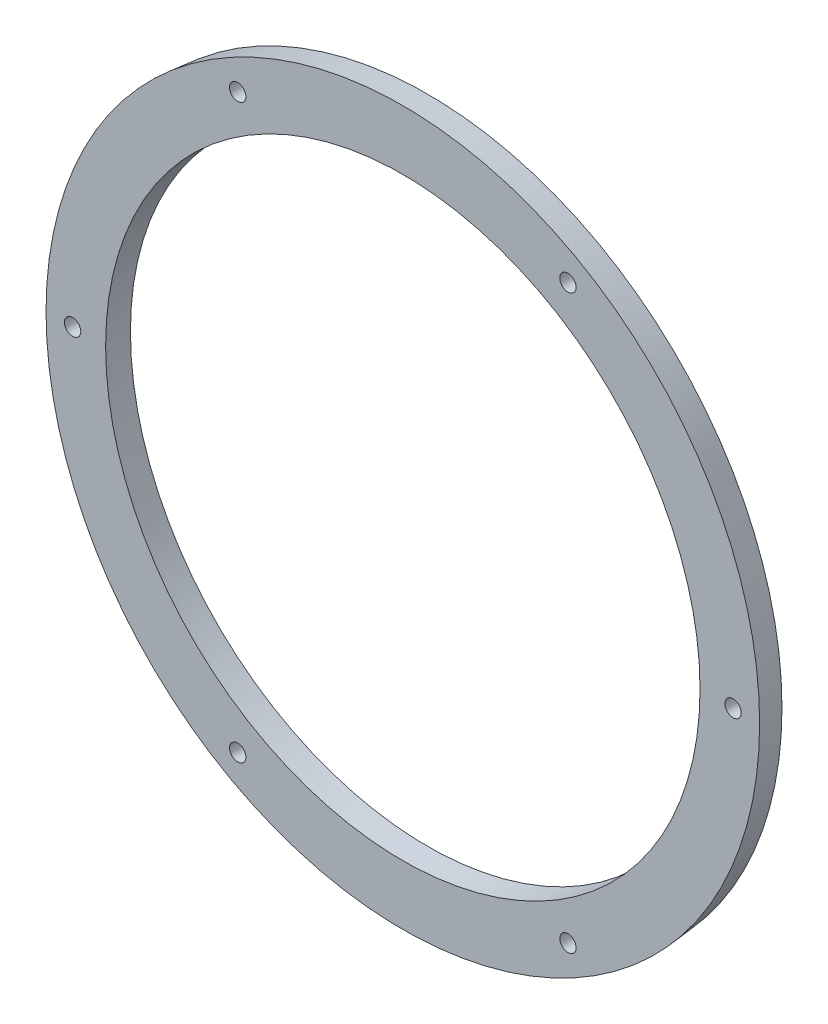
ISO-10303-21;
HEADER;
FILE_DESCRIPTION(('STEP AP214'),'2;1');
FILE_NAME('part.step','',(''),(''),'','','');
FILE_SCHEMA(('AUTOMOTIVE_DESIGN { 1 0 10303 214 1 1 1 1 }'));
ENDSEC;
DATA;
#1=APPLICATION_CONTEXT('core data for automotive mechanical design processes');
#2=APPLICATION_PROTOCOL_DEFINITION('international standard','automotive_design',2000,#1);
#3=PRODUCT_CONTEXT('',#1,'mechanical');
#4=PRODUCT('Part','Part','',(#3));
#5=PRODUCT_RELATED_PRODUCT_CATEGORY('part','',(#4));
#6=PRODUCT_DEFINITION_FORMATION('','',#4);
#7=PRODUCT_DEFINITION_CONTEXT('part definition',#1,'design');
#8=PRODUCT_DEFINITION('design','',#6,#7);
#9=PRODUCT_DEFINITION_SHAPE('','',#8);
#10=(LENGTH_UNIT() NAMED_UNIT(*) SI_UNIT(.MILLI.,.METRE.));
#11=(NAMED_UNIT(*) PLANE_ANGLE_UNIT() SI_UNIT($,.RADIAN.));
#12=(NAMED_UNIT(*) SI_UNIT($,.STERADIAN.) SOLID_ANGLE_UNIT());
#13=UNCERTAINTY_MEASURE_WITH_UNIT(LENGTH_MEASURE(1.E-05),#10,'distance_accuracy_value','');
#14=(GEOMETRIC_REPRESENTATION_CONTEXT(3) GLOBAL_UNCERTAINTY_ASSIGNED_CONTEXT((#13)) GLOBAL_UNIT_ASSIGNED_CONTEXT((#10,
#11,#12)) REPRESENTATION_CONTEXT('',''));
#15=CARTESIAN_POINT('',(0.,0.,0.));
#16=DIRECTION('',(0.,0.,1.));
#17=DIRECTION('',(1.,0.,0.));
#18=AXIS2_PLACEMENT_3D('',#15,#16,#17);
#19=CARTESIAN_POINT('',(0.,0.,0.));
#20=DIRECTION('',(0.,0.,1.));
#21=DIRECTION('',(1.,0.,0.));
#22=AXIS2_PLACEMENT_3D('',#19,#20,#21);
#23=PLANE('',#22);
#24=CARTESIAN_POINT('',(33.25,57.5906893516652,0.));
#25=DIRECTION('',(0.,0.,1.));
#26=DIRECTION('',(1.,0.,0.));
#27=AXIS2_PLACEMENT_3D('',#24,#25,#26);
#28=CIRCLE('',#27,1.65);
#29=CARTESIAN_POINT('',(34.9,57.5906893516652,0.));
#30=VERTEX_POINT('',#29);
#31=EDGE_CURVE('E77',#30,#30,#28,.T.);
#32=ORIENTED_EDGE('',*,*,#31,.T.);
#33=EDGE_LOOP('',(#32));
#34=FACE_BOUND('',#33,.T.);
#35=CARTESIAN_POINT('',(-33.25,57.5906893516652,0.));
#36=DIRECTION('',(0.,0.,1.));
#37=DIRECTION('',(1.,0.,0.));
#38=AXIS2_PLACEMENT_3D('',#35,#36,#37);
#39=CIRCLE('',#38,1.65);
#40=CARTESIAN_POINT('',(-31.6,57.5906893516652,0.));
#41=VERTEX_POINT('',#40);
#42=EDGE_CURVE('E71',#41,#41,#39,.T.);
#43=ORIENTED_EDGE('',*,*,#42,.T.);
#44=EDGE_LOOP('',(#43));
#45=FACE_BOUND('',#44,.T.);
#46=CARTESIAN_POINT('',(-66.5,0.,0.));
#47=DIRECTION('',(0.,0.,1.));
#48=DIRECTION('',(1.,0.,0.));
#49=AXIS2_PLACEMENT_3D('',#46,#47,#48);
#50=CIRCLE('',#49,1.65);
#51=CARTESIAN_POINT('',(-64.85,0.,0.));
#52=VERTEX_POINT('',#51);
#53=EDGE_CURVE('E65',#52,#52,#50,.T.);
#54=ORIENTED_EDGE('',*,*,#53,.T.);
#55=EDGE_LOOP('',(#54));
#56=FACE_BOUND('',#55,.T.);
#57=CARTESIAN_POINT('',(-33.25,-57.5906893516652,0.));
#58=DIRECTION('',(0.,0.,1.));
#59=DIRECTION('',(1.,0.,0.));
#60=AXIS2_PLACEMENT_3D('',#57,#58,#59);
#61=CIRCLE('',#60,1.65);
#62=CARTESIAN_POINT('',(-31.6,-57.5906893516652,0.));
#63=VERTEX_POINT('',#62);
#64=EDGE_CURVE('E59',#63,#63,#61,.T.);
#65=ORIENTED_EDGE('',*,*,#64,.T.);
#66=EDGE_LOOP('',(#65));
#67=FACE_BOUND('',#66,.T.);
#68=CARTESIAN_POINT('',(33.25,-57.5906893516652,0.));
#69=DIRECTION('',(0.,0.,1.));
#70=DIRECTION('',(1.,0.,0.));
#71=AXIS2_PLACEMENT_3D('',#68,#69,#70);
#72=CIRCLE('',#71,1.65);
#73=CARTESIAN_POINT('',(34.9,-57.5906893516652,0.));
#74=VERTEX_POINT('',#73);
#75=EDGE_CURVE('E53',#74,#74,#72,.T.);
#76=ORIENTED_EDGE('',*,*,#75,.T.);
#77=EDGE_LOOP('',(#76));
#78=FACE_BOUND('',#77,.T.);
#79=CARTESIAN_POINT('',(66.5,0.,0.));
#80=DIRECTION('',(0.,0.,1.));
#81=DIRECTION('',(1.,0.,0.));
#82=AXIS2_PLACEMENT_3D('',#79,#80,#81);
#83=CIRCLE('',#82,1.65);
#84=CARTESIAN_POINT('',(68.15,0.,0.));
#85=VERTEX_POINT('',#84);
#86=EDGE_CURVE('E47',#85,#85,#83,.T.);
#87=ORIENTED_EDGE('',*,*,#86,.T.);
#88=EDGE_LOOP('',(#87));
#89=FACE_BOUND('',#88,.T.);
#90=CARTESIAN_POINT('',(0.,0.,0.));
#91=DIRECTION('',(0.,0.,1.));
#92=DIRECTION('',(1.,0.,0.));
#93=AXIS2_PLACEMENT_3D('',#90,#91,#92);
#94=CIRCLE('',#93,59.85);
#95=CARTESIAN_POINT('',(59.85,0.,0.));
#96=VERTEX_POINT('',#95);
#97=EDGE_CURVE('E38',#96,#96,#94,.T.);
#98=ORIENTED_EDGE('',*,*,#97,.T.);
#99=EDGE_LOOP('',(#98));
#100=FACE_BOUND('',#99,.T.);
#101=CARTESIAN_POINT('',(0.,0.,0.));
#102=DIRECTION('',(0.,0.,-1.));
#103=DIRECTION('',(-1.,0.,0.));
#104=AXIS2_PLACEMENT_3D('',#101,#102,#103);
#105=CIRCLE('',#104,71.35);
#106=CARTESIAN_POINT('',(-71.35,0.,0.));
#107=VERTEX_POINT('',#106);
#108=EDGE_CURVE('E80',#107,#107,#105,.T.);
#109=ORIENTED_EDGE('',*,*,#108,.T.);
#110=EDGE_LOOP('',(#109));
#111=FACE_BOUND('',#110,.T.);
#112=ADVANCED_FACE('F35',(#34,#45,#56,#67,#78,#89,#100,#111),#23,.F.);
#113=CARTESIAN_POINT('',(0.,0.,5.));
#114=DIRECTION('',(0.,0.,1.));
#115=DIRECTION('',(1.,0.,0.));
#116=AXIS2_PLACEMENT_3D('',#113,#114,#115);
#117=PLANE('',#116);
#118=CARTESIAN_POINT('',(-33.25,57.5906893516652,5.));
#119=DIRECTION('',(0.,0.,1.));
#120=DIRECTION('',(1.,0.,0.));
#121=AXIS2_PLACEMENT_3D('',#118,#119,#120);
#122=CIRCLE('',#121,1.65);
#123=CARTESIAN_POINT('',(-31.6,57.5906893516652,5.));
#124=VERTEX_POINT('',#123);
#125=EDGE_CURVE('E68',#124,#124,#122,.T.);
#126=ORIENTED_EDGE('',*,*,#125,.F.);
#127=EDGE_LOOP('',(#126));
#128=FACE_BOUND('',#127,.T.);
#129=CARTESIAN_POINT('',(-33.25,-57.5906893516652,5.));
#130=DIRECTION('',(0.,0.,1.));
#131=DIRECTION('',(1.,0.,0.));
#132=AXIS2_PLACEMENT_3D('',#129,#130,#131);
#133=CIRCLE('',#132,1.65);
#134=CARTESIAN_POINT('',(-31.6,-57.5906893516652,5.));
#135=VERTEX_POINT('',#134);
#136=EDGE_CURVE('E56',#135,#135,#133,.T.);
#137=ORIENTED_EDGE('',*,*,#136,.F.);
#138=EDGE_LOOP('',(#137));
#139=FACE_BOUND('',#138,.T.);
#140=CARTESIAN_POINT('',(66.5,0.,5.));
#141=DIRECTION('',(0.,0.,1.));
#142=DIRECTION('',(1.,0.,0.));
#143=AXIS2_PLACEMENT_3D('',#140,#141,#142);
#144=CIRCLE('',#143,1.65);
#145=CARTESIAN_POINT('',(68.15,0.,5.));
#146=VERTEX_POINT('',#145);
#147=EDGE_CURVE('E45',#146,#146,#144,.T.);
#148=ORIENTED_EDGE('',*,*,#147,.F.);
#149=EDGE_LOOP('',(#148));
#150=FACE_BOUND('',#149,.T.);
#151=CARTESIAN_POINT('',(0.,0.,5.));
#152=DIRECTION('',(0.,0.,-1.));
#153=DIRECTION('',(-1.,0.,0.));
#154=AXIS2_PLACEMENT_3D('',#151,#152,#153);
#155=CIRCLE('',#154,71.85);
#156=CARTESIAN_POINT('',(-71.85,0.,5.));
#157=VERTEX_POINT('',#156);
#158=EDGE_CURVE('E85',#157,#157,#155,.T.);
#159=ORIENTED_EDGE('',*,*,#158,.F.);
#160=EDGE_LOOP('',(#159));
#161=FACE_BOUND('',#160,.T.);
#162=CARTESIAN_POINT('',(0.,0.,5.));
#163=DIRECTION('',(0.,0.,1.));
#164=DIRECTION('',(1.,0.,0.));
#165=AXIS2_PLACEMENT_3D('',#162,#163,#164);
#166=CIRCLE('',#165,59.85);
#167=CARTESIAN_POINT('',(59.85,0.,5.));
#168=VERTEX_POINT('',#167);
#169=EDGE_CURVE('E10',#168,#168,#166,.T.);
#170=ORIENTED_EDGE('',*,*,#169,.F.);
#171=EDGE_LOOP('',(#170));
#172=FACE_BOUND('',#171,.T.);
#173=CARTESIAN_POINT('',(33.25,-57.5906893516652,5.));
#174=DIRECTION('',(0.,0.,1.));
#175=DIRECTION('',(1.,0.,0.));
#176=AXIS2_PLACEMENT_3D('',#173,#174,#175);
#177=CIRCLE('',#176,1.65);
#178=CARTESIAN_POINT('',(34.9,-57.5906893516652,5.));
#179=VERTEX_POINT('',#178);
#180=EDGE_CURVE('E50',#179,#179,#177,.T.);
#181=ORIENTED_EDGE('',*,*,#180,.F.);
#182=EDGE_LOOP('',(#181));
#183=FACE_BOUND('',#182,.T.);
#184=CARTESIAN_POINT('',(-66.5,0.,5.));
#185=DIRECTION('',(0.,0.,1.));
#186=DIRECTION('',(1.,0.,0.));
#187=AXIS2_PLACEMENT_3D('',#184,#185,#186);
#188=CIRCLE('',#187,1.65);
#189=CARTESIAN_POINT('',(-64.85,0.,5.));
#190=VERTEX_POINT('',#189);
#191=EDGE_CURVE('E62',#190,#190,#188,.T.);
#192=ORIENTED_EDGE('',*,*,#191,.F.);
#193=EDGE_LOOP('',(#192));
#194=FACE_BOUND('',#193,.T.);
#195=CARTESIAN_POINT('',(33.25,57.5906893516652,5.));
#196=DIRECTION('',(0.,0.,1.));
#197=DIRECTION('',(1.,0.,0.));
#198=AXIS2_PLACEMENT_3D('',#195,#196,#197);
#199=CIRCLE('',#198,1.65);
#200=CARTESIAN_POINT('',(34.9,57.5906893516652,5.));
#201=VERTEX_POINT('',#200);
#202=EDGE_CURVE('E74',#201,#201,#199,.T.);
#203=ORIENTED_EDGE('',*,*,#202,.F.);
#204=EDGE_LOOP('',(#203));
#205=FACE_BOUND('',#204,.T.);
#206=ADVANCED_FACE('F92',(#128,#139,#150,#161,#172,#183,#194,#205),#117,.T.);
#207=CARTESIAN_POINT('',(0.,0.,5.));
#208=DIRECTION('',(0.,0.,-1.));
#209=DIRECTION('',(-1.,0.,0.));
#210=AXIS2_PLACEMENT_3D('',#207,#208,#209);
#211=CYLINDRICAL_SURFACE('',#210,59.85);
#212=ORIENTED_EDGE('',*,*,#169,.T.);
#213=EDGE_LOOP('',(#212));
#214=FACE_BOUND('',#213,.T.);
#215=ORIENTED_EDGE('',*,*,#97,.F.);
#216=EDGE_LOOP('',(#215));
#217=FACE_BOUND('',#216,.T.);
#218=ADVANCED_FACE('F95',(#214,#217),#211,.F.);
#219=CARTESIAN_POINT('',(66.5,0.,5.));
#220=DIRECTION('',(0.,0.,-1.));
#221=DIRECTION('',(-1.,0.,0.));
#222=AXIS2_PLACEMENT_3D('',#219,#220,#221);
#223=CYLINDRICAL_SURFACE('',#222,1.65);
#224=ORIENTED_EDGE('',*,*,#147,.T.);
#225=EDGE_LOOP('',(#224));
#226=FACE_BOUND('',#225,.T.);
#227=ORIENTED_EDGE('',*,*,#86,.F.);
#228=EDGE_LOOP('',(#227));
#229=FACE_BOUND('',#228,.T.);
#230=ADVANCED_FACE('F146',(#226,#229),#223,.F.);
#231=CARTESIAN_POINT('',(33.25,-57.5906893516652,5.));
#232=DIRECTION('',(0.,0.,-1.));
#233=DIRECTION('',(-1.,0.,0.));
#234=AXIS2_PLACEMENT_3D('',#231,#232,#233);
#235=CYLINDRICAL_SURFACE('',#234,1.65);
#236=ORIENTED_EDGE('',*,*,#180,.T.);
#237=EDGE_LOOP('',(#236));
#238=FACE_BOUND('',#237,.T.);
#239=ORIENTED_EDGE('',*,*,#75,.F.);
#240=EDGE_LOOP('',(#239));
#241=FACE_BOUND('',#240,.T.);
#242=ADVANCED_FACE('F142',(#238,#241),#235,.F.);
#243=CARTESIAN_POINT('',(-33.25,-57.5906893516652,5.));
#244=DIRECTION('',(0.,0.,-1.));
#245=DIRECTION('',(-1.,0.,0.));
#246=AXIS2_PLACEMENT_3D('',#243,#244,#245);
#247=CYLINDRICAL_SURFACE('',#246,1.65);
#248=ORIENTED_EDGE('',*,*,#136,.T.);
#249=EDGE_LOOP('',(#248));
#250=FACE_BOUND('',#249,.T.);
#251=ORIENTED_EDGE('',*,*,#64,.F.);
#252=EDGE_LOOP('',(#251));
#253=FACE_BOUND('',#252,.T.);
#254=ADVANCED_FACE('F138',(#250,#253),#247,.F.);
#255=CARTESIAN_POINT('',(-66.5,0.,5.));
#256=DIRECTION('',(0.,0.,-1.));
#257=DIRECTION('',(-1.,0.,0.));
#258=AXIS2_PLACEMENT_3D('',#255,#256,#257);
#259=CYLINDRICAL_SURFACE('',#258,1.65);
#260=ORIENTED_EDGE('',*,*,#191,.T.);
#261=EDGE_LOOP('',(#260));
#262=FACE_BOUND('',#261,.T.);
#263=ORIENTED_EDGE('',*,*,#53,.F.);
#264=EDGE_LOOP('',(#263));
#265=FACE_BOUND('',#264,.T.);
#266=ADVANCED_FACE('F134',(#262,#265),#259,.F.);
#267=CARTESIAN_POINT('',(-33.25,57.5906893516652,5.));
#268=DIRECTION('',(0.,0.,-1.));
#269=DIRECTION('',(-1.,0.,0.));
#270=AXIS2_PLACEMENT_3D('',#267,#268,#269);
#271=CYLINDRICAL_SURFACE('',#270,1.65);
#272=ORIENTED_EDGE('',*,*,#125,.T.);
#273=EDGE_LOOP('',(#272));
#274=FACE_BOUND('',#273,.T.);
#275=ORIENTED_EDGE('',*,*,#42,.F.);
#276=EDGE_LOOP('',(#275));
#277=FACE_BOUND('',#276,.T.);
#278=ADVANCED_FACE('F107',(#274,#277),#271,.F.);
#279=CARTESIAN_POINT('',(33.25,57.5906893516652,5.));
#280=DIRECTION('',(0.,0.,-1.));
#281=DIRECTION('',(-1.,0.,0.));
#282=AXIS2_PLACEMENT_3D('',#279,#280,#281);
#283=CYLINDRICAL_SURFACE('',#282,1.65);
#284=ORIENTED_EDGE('',*,*,#202,.T.);
#285=EDGE_LOOP('',(#284));
#286=FACE_BOUND('',#285,.T.);
#287=ORIENTED_EDGE('',*,*,#31,.F.);
#288=EDGE_LOOP('',(#287));
#289=FACE_BOUND('',#288,.T.);
#290=ADVANCED_FACE('F104',(#286,#289),#283,.F.);
#291=CARTESIAN_POINT('',(0.,0.,0.));
#292=DIRECTION('',(0.,0.,1.));
#293=DIRECTION('',(1.,0.,0.));
#294=AXIS2_PLACEMENT_3D('',#291,#292,#293);
#295=CONICAL_SURFACE('',#294,71.35,0.0996686524911621);
#296=ORIENTED_EDGE('',*,*,#158,.T.);
#297=EDGE_LOOP('',(#296));
#298=FACE_BOUND('',#297,.T.);
#299=ORIENTED_EDGE('',*,*,#108,.F.);
#300=EDGE_LOOP('',(#299));
#301=FACE_BOUND('',#300,.T.);
#302=ADVANCED_FACE('F89',(#298,#301),#295,.T.);
#303=CLOSED_SHELL('',(#112,#206,#218,#230,#242,#254,#266,#278,#290,#302));
#304=MANIFOLD_SOLID_BREP('B2',#303);
#305=ADVANCED_BREP_SHAPE_REPRESENTATION('',(#18,#304),#14);
#306=SHAPE_DEFINITION_REPRESENTATION(#9,#305);
ENDSEC;
END-ISO-10303-21;
